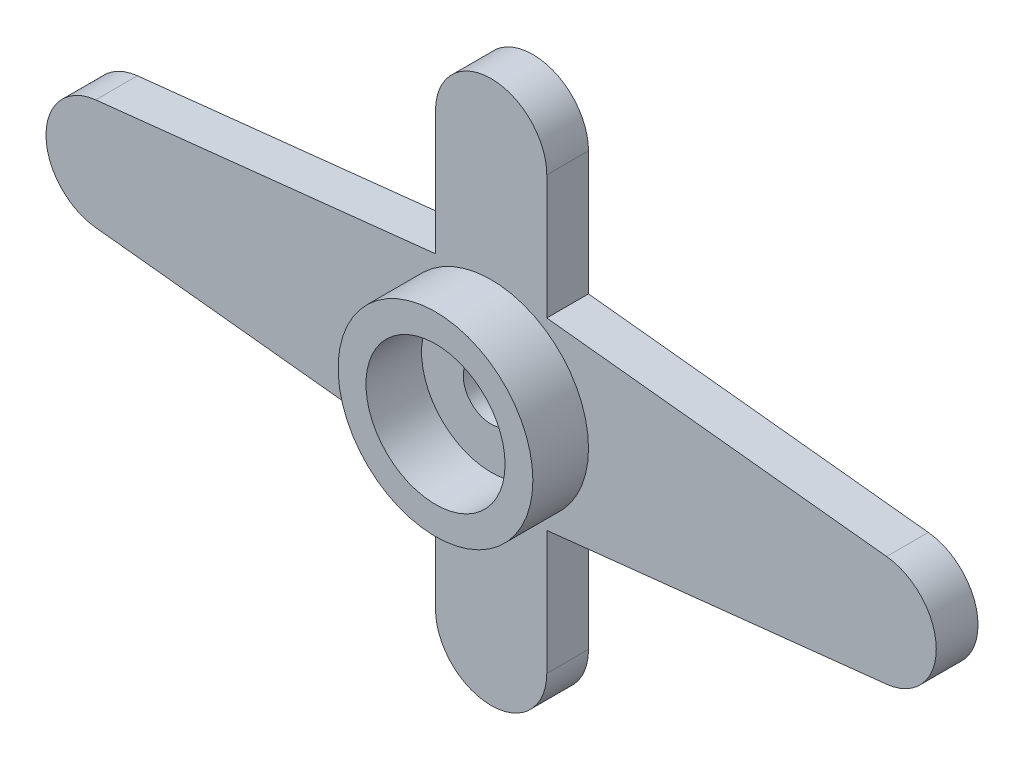
ISO-10303-21;
HEADER;
FILE_DESCRIPTION(('STEP AP214'),'2;1');
FILE_NAME('part.step','',(''),(''),'','','');
FILE_SCHEMA(('AUTOMOTIVE_DESIGN { 1 0 10303 214 1 1 1 1 }'));
ENDSEC;
DATA;
#1=APPLICATION_CONTEXT('core data for automotive mechanical design processes');
#2=APPLICATION_PROTOCOL_DEFINITION('international standard','automotive_design',2000,#1);
#3=PRODUCT_CONTEXT('',#1,'mechanical');
#4=PRODUCT('Part','Part','',(#3));
#5=PRODUCT_RELATED_PRODUCT_CATEGORY('part','',(#4));
#6=PRODUCT_DEFINITION_FORMATION('','',#4);
#7=PRODUCT_DEFINITION_CONTEXT('part definition',#1,'design');
#8=PRODUCT_DEFINITION('design','',#6,#7);
#9=PRODUCT_DEFINITION_SHAPE('','',#8);
#10=(LENGTH_UNIT() NAMED_UNIT(*) SI_UNIT(.MILLI.,.METRE.));
#11=(NAMED_UNIT(*) PLANE_ANGLE_UNIT() SI_UNIT($,.RADIAN.));
#12=(NAMED_UNIT(*) SI_UNIT($,.STERADIAN.) SOLID_ANGLE_UNIT());
#13=UNCERTAINTY_MEASURE_WITH_UNIT(LENGTH_MEASURE(1.E-05),#10,'distance_accuracy_value','');
#14=(GEOMETRIC_REPRESENTATION_CONTEXT(3) GLOBAL_UNCERTAINTY_ASSIGNED_CONTEXT((#13)) GLOBAL_UNIT_ASSIGNED_CONTEXT((#10,
#11,#12)) REPRESENTATION_CONTEXT('',''));
#15=CARTESIAN_POINT('',(0.,0.,0.));
#16=DIRECTION('',(0.,0.,1.));
#17=DIRECTION('',(1.,0.,0.));
#18=AXIS2_PLACEMENT_3D('',#15,#16,#17);
#19=CARTESIAN_POINT('',(0.,0.,3.7));
#20=DIRECTION('',(0.,0.,-1.));
#21=DIRECTION('',(-1.,0.,0.));
#22=AXIS2_PLACEMENT_3D('',#19,#20,#21);
#23=CYLINDRICAL_SURFACE('',#22,3.5);
#24=CARTESIAN_POINT('',(0.,0.,1.5));
#25=DIRECTION('',(0.,0.,1.));
#26=DIRECTION('',(1.,0.,0.));
#27=AXIS2_PLACEMENT_3D('',#24,#25,#26);
#28=CIRCLE('',#27,3.5);
#29=CARTESIAN_POINT('',(3.5,0.,1.5));
#30=VERTEX_POINT('',#29);
#31=EDGE_CURVE('E165',#30,#30,#28,.T.);
#32=ORIENTED_EDGE('',*,*,#31,.T.);
#33=EDGE_LOOP('',(#32));
#34=FACE_BOUND('',#33,.T.);
#35=CARTESIAN_POINT('',(0.,0.,3.5));
#36=DIRECTION('',(0.,0.,1.));
#37=DIRECTION('',(1.,0.,0.));
#38=AXIS2_PLACEMENT_3D('',#35,#36,#37);
#39=CIRCLE('',#38,3.5);
#40=CARTESIAN_POINT('',(3.5,0.,3.5));
#41=VERTEX_POINT('',#40);
#42=EDGE_CURVE('E223',#41,#41,#39,.T.);
#43=ORIENTED_EDGE('',*,*,#42,.F.);
#44=EDGE_LOOP('',(#43));
#45=FACE_BOUND('',#44,.T.);
#46=ADVANCED_FACE('F37',(#34,#45),#23,.T.);
#47=CARTESIAN_POINT('',(0.,0.,3.7));
#48=DIRECTION('',(0.,0.,-1.));
#49=DIRECTION('',(-1.,0.,0.));
#50=AXIS2_PLACEMENT_3D('',#47,#48,#49);
#51=CYLINDRICAL_SURFACE('',#50,2.5);
#52=CARTESIAN_POINT('',(0.,0.,1.5));
#53=DIRECTION('',(0.,0.,1.));
#54=DIRECTION('',(1.,0.,0.));
#55=AXIS2_PLACEMENT_3D('',#52,#53,#54);
#56=CIRCLE('',#55,2.5);
#57=CARTESIAN_POINT('',(2.5,0.,1.5));
#58=VERTEX_POINT('',#57);
#59=EDGE_CURVE('E11',#58,#58,#56,.F.);
#60=ORIENTED_EDGE('',*,*,#59,.T.);
#61=EDGE_LOOP('',(#60));
#62=FACE_BOUND('',#61,.T.);
#63=CARTESIAN_POINT('',(0.,0.,3.5));
#64=DIRECTION('',(0.,0.,1.));
#65=DIRECTION('',(1.,0.,0.));
#66=AXIS2_PLACEMENT_3D('',#63,#64,#65);
#67=CIRCLE('',#66,2.5);
#68=CARTESIAN_POINT('',(2.5,0.,3.5));
#69=VERTEX_POINT('',#68);
#70=EDGE_CURVE('E41',#69,#69,#67,.T.);
#71=ORIENTED_EDGE('',*,*,#70,.T.);
#72=EDGE_LOOP('',(#71));
#73=FACE_BOUND('',#72,.T.);
#74=ADVANCED_FACE('F272',(#62,#73),#51,.F.);
#75=CARTESIAN_POINT('',(0.,0.,-0.000999999999999916));
#76=DIRECTION('',(0.,0.,1.));
#77=DIRECTION('',(1.,0.,0.));
#78=AXIS2_PLACEMENT_3D('',#75,#76,#77);
#79=CYLINDRICAL_SURFACE('',#78,1.);
#80=CARTESIAN_POINT('',(0.,0.,1.5));
#81=DIRECTION('',(0.,0.,1.));
#82=DIRECTION('',(1.,0.,0.));
#83=AXIS2_PLACEMENT_3D('',#80,#81,#82);
#84=CIRCLE('',#83,1.);
#85=CARTESIAN_POINT('',(1.,0.,1.5));
#86=VERTEX_POINT('',#85);
#87=EDGE_CURVE('E211',#86,#86,#84,.T.);
#88=ORIENTED_EDGE('',*,*,#87,.T.);
#89=EDGE_LOOP('',(#88));
#90=FACE_BOUND('',#89,.T.);
#91=CARTESIAN_POINT('',(0.,0.,1.));
#92=DIRECTION('',(0.,0.,-1.));
#93=DIRECTION('',(-1.,0.,0.));
#94=AXIS2_PLACEMENT_3D('',#91,#92,#93);
#95=CIRCLE('',#94,1.);
#96=CARTESIAN_POINT('',(-1.,0.,1.));
#97=VERTEX_POINT('',#96);
#98=EDGE_CURVE('E209',#97,#97,#95,.F.);
#99=ORIENTED_EDGE('',*,*,#98,.F.);
#100=EDGE_LOOP('',(#99));
#101=FACE_BOUND('',#100,.T.);
#102=ADVANCED_FACE('F278',(#90,#101),#79,.F.);
#103=CARTESIAN_POINT('',(14.,0.,1.5));
#104=DIRECTION('',(0.,0.,-1.));
#105=DIRECTION('',(-1.,0.,0.));
#106=AXIS2_PLACEMENT_3D('',#103,#104,#105);
#107=CYLINDRICAL_SURFACE('',#106,2.);
#108=CARTESIAN_POINT('',(14.,0.,0.));
#109=DIRECTION('',(0.,0.,1.));
#110=DIRECTION('',(1.,0.,0.));
#111=AXIS2_PLACEMENT_3D('',#108,#109,#110);
#112=CIRCLE('',#111,2.);
#113=CARTESIAN_POINT('',(14.2142857142857,-1.98848727243929,0.));
#114=VERTEX_POINT('',#113);
#115=CARTESIAN_POINT('',(14.2142857142857,1.98848727243929,0.));
#116=VERTEX_POINT('',#115);
#117=EDGE_CURVE('E161',#114,#116,#112,.T.);
#118=ORIENTED_EDGE('',*,*,#117,.T.);
#119=DIRECTION('',(0.,0.,-1.));
#120=VECTOR('',#119,1.);
#121=CARTESIAN_POINT('',(14.2142857142857,1.98848727243929,1.5));
#122=LINE('',#121,#120);
#123=CARTESIAN_POINT('',(14.2142857142857,1.98848727243929,1.5));
#124=VERTEX_POINT('',#123);
#125=EDGE_CURVE('E47',#124,#116,#122,.T.);
#126=ORIENTED_EDGE('',*,*,#125,.F.);
#127=CARTESIAN_POINT('',(14.,0.,1.5));
#128=DIRECTION('',(0.,0.,1.));
#129=DIRECTION('',(1.,0.,0.));
#130=AXIS2_PLACEMENT_3D('',#127,#128,#129);
#131=CIRCLE('',#130,2.);
#132=CARTESIAN_POINT('',(14.2142857142857,-1.98848727243929,1.5));
#133=VERTEX_POINT('',#132);
#134=EDGE_CURVE('E184',#133,#124,#131,.T.);
#135=ORIENTED_EDGE('',*,*,#134,.F.);
#136=DIRECTION('',(0.,0.,-1.));
#137=VECTOR('',#136,1.);
#138=CARTESIAN_POINT('',(14.2142857142857,-1.98848727243929,1.5));
#139=LINE('',#138,#137);
#140=EDGE_CURVE('E157',#133,#114,#139,.T.);
#141=ORIENTED_EDGE('',*,*,#140,.T.);
#142=EDGE_LOOP('',(#118,#126,#135,#141));
#143=FACE_BOUND('',#142,.T.);
#144=ADVANCED_FACE('F39',(#143),#107,.T.);
#145=CARTESIAN_POINT('',(2.,3.30473755729266,1.5));
#146=DIRECTION('',(-0.107142857142857,-0.994243636219647,0.));
#147=DIRECTION('',(0.994243636219647,-0.107142857142857,0.));
#148=AXIS2_PLACEMENT_3D('',#145,#146,#147);
#149=PLANE('',#148);
#150=DIRECTION('',(-0.994243636219647,0.107142857142857,0.));
#151=VECTOR('',#150,1.);
#152=CARTESIAN_POINT('',(2.,3.30473755729266,0.));
#153=LINE('',#152,#151);
#154=CARTESIAN_POINT('',(2.,3.30473755729266,0.));
#155=VERTEX_POINT('',#154);
#156=EDGE_CURVE('E164',#116,#155,#153,.T.);
#157=ORIENTED_EDGE('',*,*,#156,.T.);
#158=DIRECTION('',(0.,0.,-1.));
#159=VECTOR('',#158,1.);
#160=CARTESIAN_POINT('',(2.,3.30473755729266,1.5));
#161=LINE('',#160,#159);
#162=CARTESIAN_POINT('',(2.,3.30473755729266,1.5));
#163=VERTEX_POINT('',#162);
#164=EDGE_CURVE('E206',#163,#155,#161,.T.);
#165=ORIENTED_EDGE('',*,*,#164,.F.);
#166=DIRECTION('',(-0.994243636219647,0.107142857142857,0.));
#167=VECTOR('',#166,1.);
#168=CARTESIAN_POINT('',(2.,3.30473755729266,1.5));
#169=LINE('',#168,#167);
#170=EDGE_CURVE('E112',#124,#163,#169,.T.);
#171=ORIENTED_EDGE('',*,*,#170,.F.);
#172=ORIENTED_EDGE('',*,*,#125,.T.);
#173=EDGE_LOOP('',(#157,#165,#171,#172));
#174=FACE_BOUND('',#173,.T.);
#175=ADVANCED_FACE('F309',(#174),#149,.F.);
#176=CARTESIAN_POINT('',(2.,7.75863864960814,1.5));
#177=DIRECTION('',(-1.,0.,0.));
#178=DIRECTION('',(0.,-1.,0.));
#179=AXIS2_PLACEMENT_3D('',#176,#177,#178);
#180=PLANE('',#179);
#181=DIRECTION('',(0.,1.,0.));
#182=VECTOR('',#181,1.);
#183=CARTESIAN_POINT('',(2.,7.75863864960814,0.));
#184=LINE('',#183,#182);
#185=CARTESIAN_POINT('',(2.,7.75863864960814,0.));
#186=VERTEX_POINT('',#185);
#187=EDGE_CURVE('E167',#155,#186,#184,.T.);
#188=ORIENTED_EDGE('',*,*,#187,.T.);
#189=DIRECTION('',(0.,0.,-1.));
#190=VECTOR('',#189,1.);
#191=CARTESIAN_POINT('',(2.,7.75863864960814,1.5));
#192=LINE('',#191,#190);
#193=CARTESIAN_POINT('',(2.,7.75863864960814,1.5));
#194=VERTEX_POINT('',#193);
#195=EDGE_CURVE('E203',#194,#186,#192,.T.);
#196=ORIENTED_EDGE('',*,*,#195,.F.);
#197=DIRECTION('',(0.,1.,0.));
#198=VECTOR('',#197,1.);
#199=CARTESIAN_POINT('',(2.,7.75863864960814,1.5));
#200=LINE('',#199,#198);
#201=EDGE_CURVE('E231',#163,#194,#200,.T.);
#202=ORIENTED_EDGE('',*,*,#201,.F.);
#203=ORIENTED_EDGE('',*,*,#164,.T.);
#204=EDGE_LOOP('',(#188,#196,#202,#203));
#205=FACE_BOUND('',#204,.T.);
#206=ADVANCED_FACE('F323',(#205),#180,.F.);
#207=CARTESIAN_POINT('',(0.,7.75863864960814,1.5));
#208=DIRECTION('',(0.,0.,-1.));
#209=DIRECTION('',(-1.,0.,0.));
#210=AXIS2_PLACEMENT_3D('',#207,#208,#209);
#211=CYLINDRICAL_SURFACE('',#210,2.);
#212=CARTESIAN_POINT('',(0.,7.75863864960814,0.));
#213=DIRECTION('',(0.,0.,1.));
#214=DIRECTION('',(1.,0.,0.));
#215=AXIS2_PLACEMENT_3D('',#212,#213,#214);
#216=CIRCLE('',#215,2.);
#217=CARTESIAN_POINT('',(-2.,7.75863864960814,0.));
#218=VERTEX_POINT('',#217);
#219=EDGE_CURVE('E169',#186,#218,#216,.T.);
#220=ORIENTED_EDGE('',*,*,#219,.T.);
#221=DIRECTION('',(0.,0.,-1.));
#222=VECTOR('',#221,1.);
#223=CARTESIAN_POINT('',(-2.,7.75863864960814,1.5));
#224=LINE('',#223,#222);
#225=CARTESIAN_POINT('',(-2.,7.75863864960814,1.5));
#226=VERTEX_POINT('',#225);
#227=EDGE_CURVE('E200',#226,#218,#224,.T.);
#228=ORIENTED_EDGE('',*,*,#227,.F.);
#229=CARTESIAN_POINT('',(0.,7.75863864960814,1.5));
#230=DIRECTION('',(0.,0.,1.));
#231=DIRECTION('',(1.,0.,0.));
#232=AXIS2_PLACEMENT_3D('',#229,#230,#231);
#233=CIRCLE('',#232,2.);
#234=EDGE_CURVE('E233',#194,#226,#233,.T.);
#235=ORIENTED_EDGE('',*,*,#234,.F.);
#236=ORIENTED_EDGE('',*,*,#195,.T.);
#237=EDGE_LOOP('',(#220,#228,#235,#236));
#238=FACE_BOUND('',#237,.T.);
#239=ADVANCED_FACE('F327',(#238),#211,.T.);
#240=CARTESIAN_POINT('',(-2.,7.75863864960814,1.5));
#241=DIRECTION('',(1.,0.,0.));
#242=DIRECTION('',(0.,1.,0.));
#243=AXIS2_PLACEMENT_3D('',#240,#241,#242);
#244=PLANE('',#243);
#245=DIRECTION('',(0.,-1.,0.));
#246=VECTOR('',#245,1.);
#247=CARTESIAN_POINT('',(-2.,7.75863864960814,0.));
#248=LINE('',#247,#246);
#249=CARTESIAN_POINT('',(-2.,3.30473755729266,0.));
#250=VERTEX_POINT('',#249);
#251=EDGE_CURVE('E171',#218,#250,#248,.T.);
#252=ORIENTED_EDGE('',*,*,#251,.T.);
#253=DIRECTION('',(0.,0.,-1.));
#254=VECTOR('',#253,1.);
#255=CARTESIAN_POINT('',(-2.,3.30473755729266,1.5));
#256=LINE('',#255,#254);
#257=CARTESIAN_POINT('',(-2.,3.30473755729266,1.5));
#258=VERTEX_POINT('',#257);
#259=EDGE_CURVE('E197',#258,#250,#256,.T.);
#260=ORIENTED_EDGE('',*,*,#259,.F.);
#261=DIRECTION('',(0.,-1.,0.));
#262=VECTOR('',#261,1.);
#263=CARTESIAN_POINT('',(-2.,7.75863864960814,1.5));
#264=LINE('',#263,#262);
#265=EDGE_CURVE('E235',#226,#258,#264,.T.);
#266=ORIENTED_EDGE('',*,*,#265,.F.);
#267=ORIENTED_EDGE('',*,*,#227,.T.);
#268=EDGE_LOOP('',(#252,#260,#266,#267));
#269=FACE_BOUND('',#268,.T.);
#270=ADVANCED_FACE('F333',(#269),#244,.F.);
#271=CARTESIAN_POINT('',(-2.,3.30473755729266,1.5));
#272=DIRECTION('',(0.107142857142857,-0.994243636219647,0.));
#273=DIRECTION('',(0.994243636219647,0.107142857142857,0.));
#274=AXIS2_PLACEMENT_3D('',#271,#272,#273);
#275=PLANE('',#274);
#276=DIRECTION('',(-0.994243636219647,-0.107142857142857,0.));
#277=VECTOR('',#276,1.);
#278=CARTESIAN_POINT('',(-2.,3.30473755729266,0.));
#279=LINE('',#278,#277);
#280=CARTESIAN_POINT('',(-14.2142857142857,1.98848727243929,0.));
#281=VERTEX_POINT('',#280);
#282=EDGE_CURVE('E173',#250,#281,#279,.T.);
#283=ORIENTED_EDGE('',*,*,#282,.T.);
#284=DIRECTION('',(0.,0.,-1.));
#285=VECTOR('',#284,1.);
#286=CARTESIAN_POINT('',(-14.2142857142857,1.98848727243929,1.5));
#287=LINE('',#286,#285);
#288=CARTESIAN_POINT('',(-14.2142857142857,1.98848727243929,1.5));
#289=VERTEX_POINT('',#288);
#290=EDGE_CURVE('E194',#289,#281,#287,.T.);
#291=ORIENTED_EDGE('',*,*,#290,.F.);
#292=DIRECTION('',(-0.994243636219647,-0.107142857142857,0.));
#293=VECTOR('',#292,1.);
#294=CARTESIAN_POINT('',(-2.,3.30473755729266,1.5));
#295=LINE('',#294,#293);
#296=EDGE_CURVE('E237',#258,#289,#295,.T.);
#297=ORIENTED_EDGE('',*,*,#296,.F.);
#298=ORIENTED_EDGE('',*,*,#259,.T.);
#299=EDGE_LOOP('',(#283,#291,#297,#298));
#300=FACE_BOUND('',#299,.T.);
#301=ADVANCED_FACE('F337',(#300),#275,.F.);
#302=CARTESIAN_POINT('',(-14.,0.,1.5));
#303=DIRECTION('',(0.,0.,-1.));
#304=DIRECTION('',(-1.,0.,0.));
#305=AXIS2_PLACEMENT_3D('',#302,#303,#304);
#306=CYLINDRICAL_SURFACE('',#305,2.);
#307=CARTESIAN_POINT('',(-14.,0.,0.));
#308=DIRECTION('',(0.,0.,1.));
#309=DIRECTION('',(-1.,0.,0.));
#310=AXIS2_PLACEMENT_3D('',#307,#308,#309);
#311=CIRCLE('',#310,2.);
#312=CARTESIAN_POINT('',(-14.2142857142857,-1.98848727243929,0.));
#313=VERTEX_POINT('',#312);
#314=EDGE_CURVE('E175',#281,#313,#311,.T.);
#315=ORIENTED_EDGE('',*,*,#314,.T.);
#316=DIRECTION('',(0.,0.,-1.));
#317=VECTOR('',#316,1.);
#318=CARTESIAN_POINT('',(-14.2142857142857,-1.98848727243929,1.5));
#319=LINE('',#318,#317);
#320=CARTESIAN_POINT('',(-14.2142857142857,-1.98848727243929,1.5));
#321=VERTEX_POINT('',#320);
#322=EDGE_CURVE('E191',#321,#313,#319,.T.);
#323=ORIENTED_EDGE('',*,*,#322,.F.);
#324=CARTESIAN_POINT('',(-14.,0.,1.5));
#325=DIRECTION('',(0.,0.,1.));
#326=DIRECTION('',(-1.,0.,0.));
#327=AXIS2_PLACEMENT_3D('',#324,#325,#326);
#328=CIRCLE('',#327,2.);
#329=EDGE_CURVE('E239',#289,#321,#328,.T.);
#330=ORIENTED_EDGE('',*,*,#329,.F.);
#331=ORIENTED_EDGE('',*,*,#290,.T.);
#332=EDGE_LOOP('',(#315,#323,#330,#331));
#333=FACE_BOUND('',#332,.T.);
#334=ADVANCED_FACE('F341',(#333),#306,.T.);
#335=CARTESIAN_POINT('',(-2.,-3.30473755729266,1.5));
#336=DIRECTION('',(0.107142857142857,0.994243636219647,0.));
#337=DIRECTION('',(-0.994243636219647,0.107142857142857,0.));
#338=AXIS2_PLACEMENT_3D('',#335,#336,#337);
#339=PLANE('',#338);
#340=DIRECTION('',(0.994243636219647,-0.107142857142857,0.));
#341=VECTOR('',#340,1.);
#342=CARTESIAN_POINT('',(-2.,-3.30473755729266,0.));
#343=LINE('',#342,#341);
#344=CARTESIAN_POINT('',(-2.,-3.30473755729266,0.));
#345=VERTEX_POINT('',#344);
#346=EDGE_CURVE('E177',#313,#345,#343,.T.);
#347=ORIENTED_EDGE('',*,*,#346,.T.);
#348=DIRECTION('',(0.,0.,-1.));
#349=VECTOR('',#348,1.);
#350=CARTESIAN_POINT('',(-2.,-3.30473755729266,1.5));
#351=LINE('',#350,#349);
#352=CARTESIAN_POINT('',(-2.,-3.30473755729266,1.5));
#353=VERTEX_POINT('',#352);
#354=EDGE_CURVE('E188',#353,#345,#351,.T.);
#355=ORIENTED_EDGE('',*,*,#354,.F.);
#356=DIRECTION('',(0.994243636219647,-0.107142857142857,0.));
#357=VECTOR('',#356,1.);
#358=CARTESIAN_POINT('',(-2.,-3.30473755729266,1.5));
#359=LINE('',#358,#357);
#360=EDGE_CURVE('E241',#321,#353,#359,.T.);
#361=ORIENTED_EDGE('',*,*,#360,.F.);
#362=ORIENTED_EDGE('',*,*,#322,.T.);
#363=EDGE_LOOP('',(#347,#355,#361,#362));
#364=FACE_BOUND('',#363,.T.);
#365=ADVANCED_FACE('F247',(#364),#339,.F.);
#366=CARTESIAN_POINT('',(-2.,-7.75863864960814,1.5));
#367=DIRECTION('',(1.,0.,0.));
#368=DIRECTION('',(0.,1.,0.));
#369=AXIS2_PLACEMENT_3D('',#366,#367,#368);
#370=PLANE('',#369);
#371=DIRECTION('',(0.,-1.,0.));
#372=VECTOR('',#371,1.);
#373=CARTESIAN_POINT('',(-2.,-7.75863864960814,0.));
#374=LINE('',#373,#372);
#375=CARTESIAN_POINT('',(-2.,-7.75863864960814,0.));
#376=VERTEX_POINT('',#375);
#377=EDGE_CURVE('E179',#345,#376,#374,.T.);
#378=ORIENTED_EDGE('',*,*,#377,.T.);
#379=DIRECTION('',(0.,0.,-1.));
#380=VECTOR('',#379,1.);
#381=CARTESIAN_POINT('',(-2.,-7.75863864960814,1.5));
#382=LINE('',#381,#380);
#383=CARTESIAN_POINT('',(-2.,-7.75863864960814,1.5));
#384=VERTEX_POINT('',#383);
#385=EDGE_CURVE('E152',#384,#376,#382,.T.);
#386=ORIENTED_EDGE('',*,*,#385,.F.);
#387=DIRECTION('',(0.,-1.,0.));
#388=VECTOR('',#387,1.);
#389=CARTESIAN_POINT('',(-2.,-7.75863864960814,1.5));
#390=LINE('',#389,#388);
#391=EDGE_CURVE('E143',#353,#384,#390,.T.);
#392=ORIENTED_EDGE('',*,*,#391,.F.);
#393=ORIENTED_EDGE('',*,*,#354,.T.);
#394=EDGE_LOOP('',(#378,#386,#392,#393));
#395=FACE_BOUND('',#394,.T.);
#396=ADVANCED_FACE('F251',(#395),#370,.F.);
#397=CARTESIAN_POINT('',(0.,-7.75863864960814,1.5));
#398=DIRECTION('',(0.,0.,-1.));
#399=DIRECTION('',(-1.,0.,0.));
#400=AXIS2_PLACEMENT_3D('',#397,#398,#399);
#401=CYLINDRICAL_SURFACE('',#400,2.);
#402=CARTESIAN_POINT('',(0.,-7.75863864960814,0.));
#403=DIRECTION('',(0.,0.,1.));
#404=DIRECTION('',(-1.,0.,0.));
#405=AXIS2_PLACEMENT_3D('',#402,#403,#404);
#406=CIRCLE('',#405,2.);
#407=CARTESIAN_POINT('',(2.,-7.75863864960814,0.));
#408=VERTEX_POINT('',#407);
#409=EDGE_CURVE('E151',#376,#408,#406,.T.);
#410=ORIENTED_EDGE('',*,*,#409,.T.);
#411=DIRECTION('',(0.,0.,-1.));
#412=VECTOR('',#411,1.);
#413=CARTESIAN_POINT('',(2.,-7.75863864960814,1.5));
#414=LINE('',#413,#412);
#415=CARTESIAN_POINT('',(2.,-7.75863864960814,1.5));
#416=VERTEX_POINT('',#415);
#417=EDGE_CURVE('E148',#416,#408,#414,.T.);
#418=ORIENTED_EDGE('',*,*,#417,.F.);
#419=CARTESIAN_POINT('',(0.,-7.75863864960814,1.5));
#420=DIRECTION('',(0.,0.,1.));
#421=DIRECTION('',(-1.,0.,0.));
#422=AXIS2_PLACEMENT_3D('',#419,#420,#421);
#423=CIRCLE('',#422,2.);
#424=EDGE_CURVE('E137',#384,#416,#423,.T.);
#425=ORIENTED_EDGE('',*,*,#424,.F.);
#426=ORIENTED_EDGE('',*,*,#385,.T.);
#427=EDGE_LOOP('',(#410,#418,#425,#426));
#428=FACE_BOUND('',#427,.T.);
#429=ADVANCED_FACE('F149',(#428),#401,.T.);
#430=CARTESIAN_POINT('',(2.,-7.75863864960814,1.5));
#431=DIRECTION('',(-1.,0.,0.));
#432=DIRECTION('',(0.,-1.,0.));
#433=AXIS2_PLACEMENT_3D('',#430,#431,#432);
#434=PLANE('',#433);
#435=DIRECTION('',(0.,1.,0.));
#436=VECTOR('',#435,1.);
#437=CARTESIAN_POINT('',(2.,-7.75863864960814,0.));
#438=LINE('',#437,#436);
#439=CARTESIAN_POINT('',(2.,-3.30473755729266,0.));
#440=VERTEX_POINT('',#439);
#441=EDGE_CURVE('E97',#408,#440,#438,.T.);
#442=ORIENTED_EDGE('',*,*,#441,.T.);
#443=DIRECTION('',(0.,0.,-1.));
#444=VECTOR('',#443,1.);
#445=CARTESIAN_POINT('',(2.,-3.30473755729266,1.5));
#446=LINE('',#445,#444);
#447=CARTESIAN_POINT('',(2.,-3.30473755729266,1.5));
#448=VERTEX_POINT('',#447);
#449=EDGE_CURVE('E153',#448,#440,#446,.T.);
#450=ORIENTED_EDGE('',*,*,#449,.F.);
#451=DIRECTION('',(0.,1.,0.));
#452=VECTOR('',#451,1.);
#453=CARTESIAN_POINT('',(2.,-7.75863864960814,1.5));
#454=LINE('',#453,#452);
#455=EDGE_CURVE('E141',#416,#448,#454,.T.);
#456=ORIENTED_EDGE('',*,*,#455,.F.);
#457=ORIENTED_EDGE('',*,*,#417,.T.);
#458=EDGE_LOOP('',(#442,#450,#456,#457));
#459=FACE_BOUND('',#458,.T.);
#460=ADVANCED_FACE('F155',(#459),#434,.F.);
#461=CARTESIAN_POINT('',(2.,-3.30473755729266,1.5));
#462=DIRECTION('',(-0.107142857142857,0.994243636219647,0.));
#463=DIRECTION('',(-0.994243636219647,-0.107142857142857,0.));
#464=AXIS2_PLACEMENT_3D('',#461,#462,#463);
#465=PLANE('',#464);
#466=DIRECTION('',(0.994243636219647,0.107142857142857,0.));
#467=VECTOR('',#466,1.);
#468=CARTESIAN_POINT('',(2.,-3.30473755729266,0.));
#469=LINE('',#468,#467);
#470=EDGE_CURVE('E103',#440,#114,#469,.T.);
#471=ORIENTED_EDGE('',*,*,#470,.T.);
#472=ORIENTED_EDGE('',*,*,#140,.F.);
#473=DIRECTION('',(0.994243636219647,0.107142857142857,0.));
#474=VECTOR('',#473,1.);
#475=CARTESIAN_POINT('',(2.,-3.30473755729266,1.5));
#476=LINE('',#475,#474);
#477=EDGE_CURVE('E56',#448,#133,#476,.T.);
#478=ORIENTED_EDGE('',*,*,#477,.F.);
#479=ORIENTED_EDGE('',*,*,#449,.T.);
#480=EDGE_LOOP('',(#471,#472,#478,#479));
#481=FACE_BOUND('',#480,.T.);
#482=ADVANCED_FACE('F259',(#481),#465,.F.);
#483=CARTESIAN_POINT('',(14.,0.,1.5));
#484=DIRECTION('',(0.,0.,1.));
#485=DIRECTION('',(1.,0.,0.));
#486=AXIS2_PLACEMENT_3D('',#483,#484,#485);
#487=PLANE('',#486);
#488=ORIENTED_EDGE('',*,*,#31,.F.);
#489=EDGE_LOOP('',(#488));
#490=FACE_BOUND('',#489,.T.);
#491=ORIENTED_EDGE('',*,*,#134,.T.);
#492=ORIENTED_EDGE('',*,*,#170,.T.);
#493=ORIENTED_EDGE('',*,*,#201,.T.);
#494=ORIENTED_EDGE('',*,*,#234,.T.);
#495=ORIENTED_EDGE('',*,*,#265,.T.);
#496=ORIENTED_EDGE('',*,*,#296,.T.);
#497=ORIENTED_EDGE('',*,*,#329,.T.);
#498=ORIENTED_EDGE('',*,*,#360,.T.);
#499=ORIENTED_EDGE('',*,*,#391,.T.);
#500=ORIENTED_EDGE('',*,*,#424,.T.);
#501=ORIENTED_EDGE('',*,*,#455,.T.);
#502=ORIENTED_EDGE('',*,*,#477,.T.);
#503=EDGE_LOOP('',(#491,#492,#493,#494,#495,#496,#497,#498,#499,#500,#501,#502));
#504=FACE_BOUND('',#503,.T.);
#505=ADVANCED_FACE('F139',(#490,#504),#487,.T.);
#506=CARTESIAN_POINT('',(14.,0.,0.));
#507=DIRECTION('',(0.,0.,1.));
#508=DIRECTION('',(1.,0.,0.));
#509=AXIS2_PLACEMENT_3D('',#506,#507,#508);
#510=PLANE('',#509);
#511=CARTESIAN_POINT('',(0.,0.,0.));
#512=DIRECTION('',(0.,0.,-1.));
#513=DIRECTION('',(-1.,0.,0.));
#514=AXIS2_PLACEMENT_3D('',#511,#512,#513);
#515=CIRCLE('',#514,2.5);
#516=CARTESIAN_POINT('',(-2.5,0.,0.));
#517=VERTEX_POINT('',#516);
#518=EDGE_CURVE('E218',#517,#517,#515,.T.);
#519=ORIENTED_EDGE('',*,*,#518,.F.);
#520=EDGE_LOOP('',(#519));
#521=FACE_BOUND('',#520,.T.);
#522=ORIENTED_EDGE('',*,*,#117,.F.);
#523=ORIENTED_EDGE('',*,*,#470,.F.);
#524=ORIENTED_EDGE('',*,*,#441,.F.);
#525=ORIENTED_EDGE('',*,*,#409,.F.);
#526=ORIENTED_EDGE('',*,*,#377,.F.);
#527=ORIENTED_EDGE('',*,*,#346,.F.);
#528=ORIENTED_EDGE('',*,*,#314,.F.);
#529=ORIENTED_EDGE('',*,*,#282,.F.);
#530=ORIENTED_EDGE('',*,*,#251,.F.);
#531=ORIENTED_EDGE('',*,*,#219,.F.);
#532=ORIENTED_EDGE('',*,*,#187,.F.);
#533=ORIENTED_EDGE('',*,*,#156,.F.);
#534=EDGE_LOOP('',(#522,#523,#524,#525,#526,#527,#528,#529,#530,#531,#532,#533));
#535=FACE_BOUND('',#534,.T.);
#536=ADVANCED_FACE('F254',(#521,#535),#510,.F.);
#537=ORIENTED_EDGE('',*,*,#87,.F.);
#538=EDGE_LOOP('',(#537));
#539=FACE_BOUND('',#538,.T.);
#540=ORIENTED_EDGE('',*,*,#59,.F.);
#541=EDGE_LOOP('',(#540));
#542=FACE_BOUND('',#541,.T.);
#543=ADVANCED_FACE('F268',(#539,#542),#487,.T.);
#544=CARTESIAN_POINT('',(0.,0.,1.));
#545=DIRECTION('',(0.,0.,-1.));
#546=DIRECTION('',(-1.,0.,0.));
#547=AXIS2_PLACEMENT_3D('',#544,#545,#546);
#548=PLANE('',#547);
#549=CARTESIAN_POINT('',(0.,0.,1.));
#550=DIRECTION('',(0.,0.,-1.));
#551=DIRECTION('',(-1.,0.,0.));
#552=AXIS2_PLACEMENT_3D('',#549,#550,#551);
#553=CIRCLE('',#552,2.5);
#554=CARTESIAN_POINT('',(-2.5,0.,1.));
#555=VERTEX_POINT('',#554);
#556=EDGE_CURVE('E212',#555,#555,#553,.T.);
#557=ORIENTED_EDGE('',*,*,#556,.T.);
#558=EDGE_LOOP('',(#557));
#559=FACE_BOUND('',#558,.T.);
#560=ORIENTED_EDGE('',*,*,#98,.T.);
#561=EDGE_LOOP('',(#560));
#562=FACE_BOUND('',#561,.T.);
#563=ADVANCED_FACE('F288',(#559,#562),#548,.T.);
#564=CARTESIAN_POINT('',(0.,0.,1.));
#565=DIRECTION('',(0.,0.,-1.));
#566=DIRECTION('',(-1.,0.,0.));
#567=AXIS2_PLACEMENT_3D('',#564,#565,#566);
#568=CYLINDRICAL_SURFACE('',#567,2.5);
#569=ORIENTED_EDGE('',*,*,#556,.F.);
#570=EDGE_LOOP('',(#569));
#571=FACE_BOUND('',#570,.T.);
#572=ORIENTED_EDGE('',*,*,#518,.T.);
#573=EDGE_LOOP('',(#572));
#574=FACE_BOUND('',#573,.T.);
#575=ADVANCED_FACE('F292',(#571,#574),#568,.F.);
#576=CARTESIAN_POINT('',(4.5131500003633,10.,3.5));
#577=DIRECTION('',(0.,0.,1.));
#578=DIRECTION('',(1.,0.,0.));
#579=AXIS2_PLACEMENT_3D('',#576,#577,#578);
#580=PLANE('',#579);
#581=ORIENTED_EDGE('',*,*,#70,.F.);
#582=EDGE_LOOP('',(#581));
#583=FACE_BOUND('',#582,.T.);
#584=ORIENTED_EDGE('',*,*,#42,.T.);
#585=EDGE_LOOP('',(#584));
#586=FACE_BOUND('',#585,.T.);
#587=ADVANCED_FACE('F294',(#583,#586),#580,.T.);
#588=CLOSED_SHELL('',(#46,#74,#102,#144,#175,#206,#239,#270,#301,#334,#365,#396,#429,#460,#482,
#505,#536,#543,#563,#575,#587));
#589=MANIFOLD_SOLID_BREP('B2',#588);
#590=ADVANCED_BREP_SHAPE_REPRESENTATION('',(#18,#589),#14);
#591=SHAPE_DEFINITION_REPRESENTATION(#9,#590);
ENDSEC;
END-ISO-10303-21;
